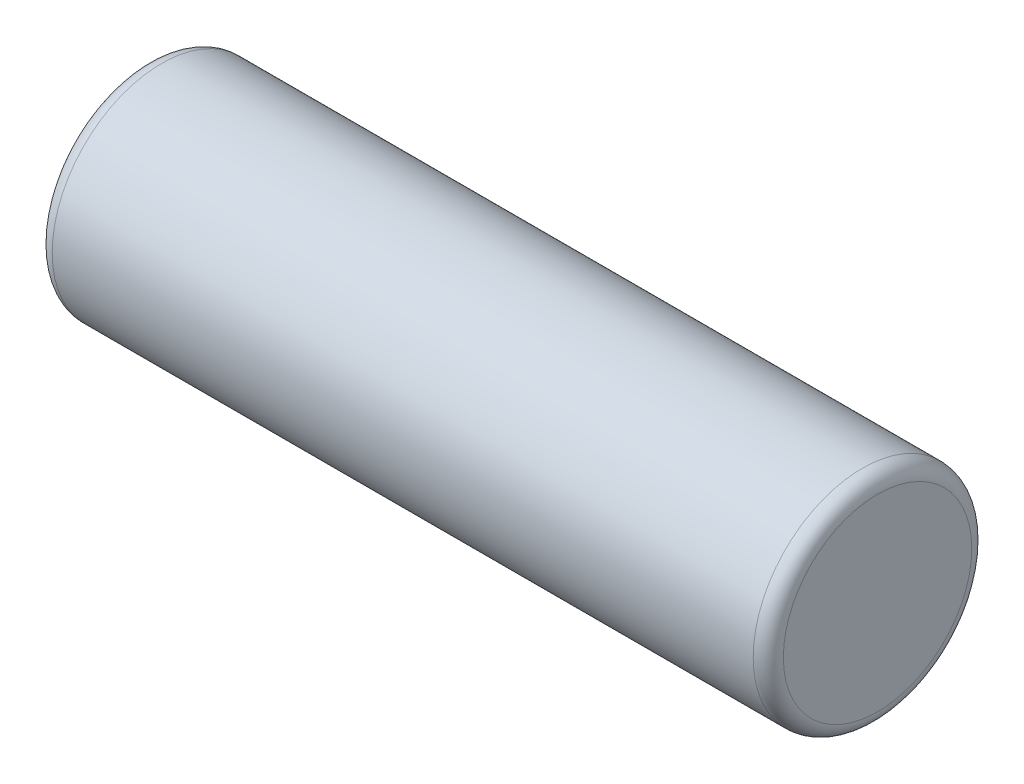
ISO-10303-21;
HEADER;
FILE_DESCRIPTION(('STEP AP214'),'2;1');
FILE_NAME('part.step','',(''),(''),'','','');
FILE_SCHEMA(('AUTOMOTIVE_DESIGN { 1 0 10303 214 1 1 1 1 }'));
ENDSEC;
DATA;
#1=APPLICATION_CONTEXT('core data for automotive mechanical design processes');
#2=APPLICATION_PROTOCOL_DEFINITION('international standard','automotive_design',2000,#1);
#3=PRODUCT_CONTEXT('',#1,'mechanical');
#4=PRODUCT('Part','Part','',(#3));
#5=PRODUCT_RELATED_PRODUCT_CATEGORY('part','',(#4));
#6=PRODUCT_DEFINITION_FORMATION('','',#4);
#7=PRODUCT_DEFINITION_CONTEXT('part definition',#1,'design');
#8=PRODUCT_DEFINITION('design','',#6,#7);
#9=PRODUCT_DEFINITION_SHAPE('','',#8);
#10=(LENGTH_UNIT() NAMED_UNIT(*) SI_UNIT(.MILLI.,.METRE.));
#11=(NAMED_UNIT(*) PLANE_ANGLE_UNIT() SI_UNIT($,.RADIAN.));
#12=(NAMED_UNIT(*) SI_UNIT($,.STERADIAN.) SOLID_ANGLE_UNIT());
#13=UNCERTAINTY_MEASURE_WITH_UNIT(LENGTH_MEASURE(1.E-05),#10,'distance_accuracy_value','');
#14=(GEOMETRIC_REPRESENTATION_CONTEXT(3) GLOBAL_UNCERTAINTY_ASSIGNED_CONTEXT((#13)) GLOBAL_UNIT_ASSIGNED_CONTEXT((#10,
#11,#12)) REPRESENTATION_CONTEXT('',''));
#15=CARTESIAN_POINT('',(0.,0.,0.));
#16=DIRECTION('',(0.,0.,1.));
#17=DIRECTION('',(1.,0.,0.));
#18=AXIS2_PLACEMENT_3D('',#15,#16,#17);
#19=CARTESIAN_POINT('',(-1.,0.,0.));
#20=DIRECTION('',(1.,0.,0.));
#21=DIRECTION('',(0.,0.,-1.));
#22=AXIS2_PLACEMENT_3D('',#19,#20,#21);
#23=PLANE('',#22);
#24=DIRECTION('',(0.,-0.0214498907795891,0.999769924625433));
#25=VECTOR('',#24,1.);
#26=CARTESIAN_POINT('',(-1.,-2.247909104811,-0.0973842647244998));
#27=LINE('',#26,#25);
#28=CARTESIAN_POINT('',(-0.999999999998785,-2.24999844077512,-9.29528188159216E-07));
#29=VERTEX_POINT('',#28);
#30=CARTESIAN_POINT('',(-0.999999999845753,-2.24790909149256,-0.0973845735524115));
#31=VERTEX_POINT('',#30);
#32=EDGE_CURVE('E84',#29,#31,#27,.F.);
#33=ORIENTED_EDGE('',*,*,#32,.F.);
#34=CARTESIAN_POINT('',(-0.999999999692457,0.,2.25001753691978));
#35=CARTESIAN_POINT('',(-0.999999999699434,-0.0368158581438385,2.25001811895792));
#36=CARTESIAN_POINT('',(-0.999999999706292,-0.0736316449703827,2.24911357081239));
#37=CARTESIAN_POINT('',(-0.999999999719771,-0.147174542179384,2.24549982211062));
#38=CARTESIAN_POINT('',(-0.999999999726392,-0.183901652585357,2.24279062203301));
#39=CARTESIAN_POINT('',(-0.999999999739396,-0.257178673049047,2.23557317837516));
#40=CARTESIAN_POINT('',(-0.999999999745779,-0.293728583153757,2.23106493527206));
#41=CARTESIAN_POINT('',(-0.999999999758308,-0.366563163265358,2.22026051344813));
#42=CARTESIAN_POINT('',(-0.999999999764454,-0.402847833342592,2.21396433520149));
#43=CARTESIAN_POINT('',(-0.999999999776508,-0.475064517351697,2.19959914612055));
#44=CARTESIAN_POINT('',(-0.999999999782417,-0.510996531377098,2.19153013575644));
#45=CARTESIAN_POINT('',(-0.999999999793996,-0.582421340968644,2.17363874000847));
#46=CARTESIAN_POINT('',(-0.999999999799667,-0.617914136651277,2.16381635508963));
#47=CARTESIAN_POINT('',(-0.999999999810772,-0.688375004304049,2.14244186941194));
#48=CARTESIAN_POINT('',(-0.999999999816206,-0.723343076413353,2.13088976911185));
#49=CARTESIAN_POINT('',(-0.999999999826836,-0.792670256111568,2.10608368487962));
#50=CARTESIAN_POINT('',(-0.999999999832032,-0.827029363861988,2.09282970139886));
#51=CARTESIAN_POINT('',(-0.999999999842187,-0.895055841048674,2.06465178137515));
#52=CARTESIAN_POINT('',(-0.999999999847146,-0.928723210668402,2.04972784527511));
#53=CARTESIAN_POINT('',(-0.999999999856826,-0.995285104322772,2.01824597405902));
#54=CARTESIAN_POINT('',(-0.999999999861547,-1.02817962856239,2.00168803937634));
#55=CARTESIAN_POINT('',(-0.999999999870753,-1.09311658607516,1.96697806135227));
#56=CARTESIAN_POINT('',(-0.999999999875237,-1.12515901957431,1.94882601843366));
#57=CARTESIAN_POINT('',(-0.999999999883968,-1.18831460302957,1.9109715546512));
#58=CARTESIAN_POINT('',(-0.999999999888214,-1.21942775323214,1.89126913419854));
#59=CARTESIAN_POINT('',(-0.99999999989647,-1.28064981628306,1.85036138102519));
#60=CARTESIAN_POINT('',(-0.999999999900479,-1.31075872939775,1.82915604870311));
#61=CARTESIAN_POINT('',(-0.99999999990826,-1.36989978379668,1.78529355809155));
#62=CARTESIAN_POINT('',(-0.999999999912032,-1.39893192536651,1.76263640018714));
#63=CARTESIAN_POINT('',(-0.999999999919338,-1.45584949627492,1.71592484225882));
#64=CARTESIAN_POINT('',(-0.999999999922872,-1.48373492591763,1.69187044260551));
#65=CARTESIAN_POINT('',(-0.999999999929704,-1.53829189513759,1.64242235107628));
#66=CARTESIAN_POINT('',(-0.999999999933001,-1.56496343503678,1.61702865955558));
#67=CARTESIAN_POINT('',(-0.999999999939357,-1.61702837133783,1.56496316062911));
#68=CARTESIAN_POINT('',(-0.999999999942417,-1.64242176807867,1.53829135356232));
#69=CARTESIAN_POINT('',(-0.999999999948298,-1.69186924382405,1.48373387894105));
#70=CARTESIAN_POINT('',(-0.999999999951121,-1.71592332318381,1.45584821170851));
#71=CARTESIAN_POINT('',(-0.999999999956527,-1.76263421649335,1.39893019641449));
#72=CARTESIAN_POINT('',(-0.999999999959112,-1.78529103081372,1.36989784865713));
#73=CARTESIAN_POINT('',(-0.999999999964044,-1.82915281253558,1.31075641439043));
#74=CARTESIAN_POINT('',(-0.999999999966391,-1.85035778032213,1.28064732816665));
#75=CARTESIAN_POINT('',(-0.999999999970849,-1.89126478512127,1.2194249529642));
#76=CARTESIAN_POINT('',(-0.999999999972959,-1.91096682253247,1.18831166425187));
#77=CARTESIAN_POINT('',(-0.999999999976941,-1.94882050344607,1.12515583924278));
#78=CARTESIAN_POINT('',(-0.999999999978813,-1.96697214735967,1.09311330319248));
#79=CARTESIAN_POINT('',(-0.999999999982321,-2.00168131319382,1.02817617727602));
#80=CARTESIAN_POINT('',(-0.999999999983956,-2.01823883553718,0.995281587635832));
#81=CARTESIAN_POINT('',(-0.999999999986989,-2.04971987057927,0.928719600940435));
#82=CARTESIAN_POINT('',(-0.999999999988387,-2.06464338371138,0.895052204090191));
#83=CARTESIAN_POINT('',(-0.999999999990945,-2.09282044905633,0.827025711088068));
#84=CARTESIAN_POINT('',(-0.999999999992105,-2.1060740017121,0.792666615119646));
#85=CARTESIAN_POINT('',(-0.999999999994188,-2.13087921836098,0.723339498336484));
#86=CARTESIAN_POINT('',(-0.999999999995111,-2.14243088280548,0.688371477683247));
#87=CARTESIAN_POINT('',(-0.999999999996719,-2.16380449369418,0.617910752815705));
#88=CARTESIAN_POINT('',(-0.999999999997404,-2.17362644059713,0.582418048740561));
#89=CARTESIAN_POINT('',(-0.999999999998538,-2.19151696012576,0.51099346257315));
#90=CARTESIAN_POINT('',(-0.999999999998986,-2.19958553321647,0.475061580597367));
#91=CARTESIAN_POINT('',(-0.999999999999645,-2.21394985047674,0.402845201044101));
#92=CARTESIAN_POINT('',(-0.999999999999855,-2.2202455951165,0.366560703560144));
#93=CARTESIAN_POINT('',(-1.00000000000004,-2.23104915537766,0.293726508951421));
#94=CARTESIAN_POINT('',(-1.00000000000001,-2.23555697147327,0.257176811896995));
#95=CARTESIAN_POINT('',(-0.999999999999721,-2.24277356969468,0.183900257613082));
#96=CARTESIAN_POINT('',(-0.999999999999457,-2.24548235229762,0.147173400430584));
#97=CARTESIAN_POINT('',(-0.999999999998691,-2.24909527753464,0.0736310493451681));
#98=CARTESIAN_POINT('',(-0.99999999999819,-2.24999942064734,0.0368155554657612));
#99=CARTESIAN_POINT('',(-0.999999999997569,-2.2499984407804,8.3986624298524E-13));
#100=B_SPLINE_CURVE_WITH_KNOTS('',3,(#34,#35,#36,#37,#38,#39,#40,#41,#42,#43,#44,#45,#46,#47,
#48,#49,#50,#51,#52,#53,#54,#55,#56,#57,#58,#59,#60,#61,#62,#63,#64,#65,#66,#67,#68,#69,#70,#71,
#72,#73,#74,#75,#76,#77,#78,#79,#80,#81,#82,#83,#84,#85,#86,#87,#88,#89,#90,#91,#92,#93,#94,#95,
#96,#97,#98,#99),.UNSPECIFIED.,.F.,.F.,(4,2,2,2,2,2,2,2,2,2,2,2,2,2,2,2,2,2,2,2,2,2,2,2,2,2,2,2,
2,2,2,2,4),(0.,0.110436374464718,0.220872719639265,0.331309035523641,0.441745322117849,
0.552181579421887,0.662617807435753,0.77305400615945,0.883490175592977,0.993926315736335,
1.10436242658952,1.21479850815254,1.32523456042539,1.43567058340806,1.54610657710057,
1.65654254150291,1.76697847661507,1.87741438243707,1.9878502589689,2.09828610621055,
2.20872192416204,2.31915771282336,2.42959347219451,2.54002920227548,2.65046490306629,
2.76090057456693,2.87133621677739,2.98177182969769,3.09220741332782,3.20264296766777,
3.31307849271756,3.42351398847718,3.53394945494662),.UNSPECIFIED.);
#101=CARTESIAN_POINT('',(-0.999999999815474,0.,2.25001753691978));
#102=VERTEX_POINT('',#101);
#103=EDGE_CURVE('E75',#102,#29,#100,.T.);
#104=ORIENTED_EDGE('',*,*,#103,.F.);
#105=CARTESIAN_POINT('',(-0.999999998696299,2.24792737261029,0.097391012971594));
#106=CARTESIAN_POINT('',(-0.999999998710268,2.24637824427443,0.133158832444067));
#107=CARTESIAN_POINT('',(-0.999999998724124,2.24397407293576,0.168889544899344));
#108=CARTESIAN_POINT('',(-0.999999998751613,2.23746417887268,0.240195626249283));
#109=CARTESIAN_POINT('',(-0.999999998765245,2.23335845658712,0.275770995184008));
#110=CARTESIAN_POINT('',(-0.999999998792284,2.22345399571948,0.346685269355345));
#111=CARTESIAN_POINT('',(-0.999999998805691,2.21765525757406,0.382024174652941));
#112=CARTESIAN_POINT('',(-0.999999998832282,2.20437819565777,0.452385034953132));
#113=CARTESIAN_POINT('',(-0.999999998845465,2.19689987232008,0.487406990037468));
#114=CARTESIAN_POINT('',(-0.999999998871607,2.18028061869255,0.557054160008376));
#115=CARTESIAN_POINT('',(-0.999999998884565,2.1711396888315,0.591679374997269));
#116=CARTESIAN_POINT('',(-0.999999998910257,2.15121606303488,0.660454185549227));
#117=CARTESIAN_POINT('',(-0.999999998922992,2.14043336752273,0.694603781234959));
#118=CARTESIAN_POINT('',(-0.999999998948235,2.11725077147075,0.762349555693808));
#119=CARTESIAN_POINT('',(-0.999999998960744,2.10485087134801,0.795945734609655));
#120=CARTESIAN_POINT('',(-0.999999998985538,2.07846211667154,0.862508139328189));
#121=CARTESIAN_POINT('',(-0.999999998997824,2.06447326252762,0.895474365293345));
#122=CARTESIAN_POINT('',(-0.999999999022169,2.03493846880607,0.960701762935567));
#123=CARTESIAN_POINT('',(-0.999999999034229,2.01939252963003,0.992962934794472));
#124=CARTESIAN_POINT('',(-0.999999999058126,1.98677898245749,1.05670672933065));
#125=CARTESIAN_POINT('',(-0.999999999069962,1.96971137485344,1.08818935220871));
#126=CARTESIAN_POINT('',(-0.999999999093409,1.93409337388104,1.15030432755689));
#127=CARTESIAN_POINT('',(-0.999999999105021,1.91554298089512,1.18093668024629));
#128=CARTESIAN_POINT('',(-0.999999999128019,1.87700167020613,1.24128133105956));
#129=CARTESIAN_POINT('',(-0.999999999139406,1.85701075287459,1.27099362942071));
#130=CARTESIAN_POINT('',(-0.999999999161955,1.81563393621945,1.32943048346203));
#131=CARTESIAN_POINT('',(-0.999999999173118,1.79424803725563,1.35815503939695));
#132=CARTESIAN_POINT('',(-0.999999999195218,1.75012997799427,1.41455097071482));
#133=CARTESIAN_POINT('',(-0.999999999206156,1.72739781804395,1.44222234636939));
#134=CARTESIAN_POINT('',(-0.999999999227807,1.68063902440483,1.49644887857485));
#135=CARTESIAN_POINT('',(-0.99999999923852,1.6566123910499,1.52300403541362));
#136=CARTESIAN_POINT('',(-0.999999999259723,1.60731938715384,1.57493763436403));
#137=CARTESIAN_POINT('',(-0.999999999270212,1.58205301693245,1.60031607677916));
#138=CARTESIAN_POINT('',(-0.999999999290965,1.53033810011385,1.64983843200292));
#139=CARTESIAN_POINT('',(-0.99999999930123,1.50388955382155,1.67398234512993));
#140=CARTESIAN_POINT('',(-0.999999999321534,1.44987053879703,1.72098063935076));
#141=CARTESIAN_POINT('',(-0.999999999331574,1.42230007035418,1.74383502077715));
#142=CARTESIAN_POINT('',(-0.999999999351429,1.36610002082214,1.78820218692404));
#143=CARTESIAN_POINT('',(-0.999999999361244,1.33747044000611,1.80971497199056));
#144=CARTESIAN_POINT('',(-0.99999999938065,1.27921738828853,1.85134993710798));
#145=CARTESIAN_POINT('',(-0.999999999390241,1.24959391764332,1.87147211751754));
#146=CARTESIAN_POINT('',(-0.999999999409198,1.1894205730085,1.91028003301949));
#147=CARTESIAN_POINT('',(-0.999999999418565,1.15887069925782,1.92896576848235));
#148=CARTESIAN_POINT('',(-0.999999999437073,1.09691414558865,1.96485822622871));
#149=CARTESIAN_POINT('',(-0.999999999446215,1.06550746589114,1.98206494889366));
#150=CARTESIAN_POINT('',(-0.999999999464274,1.0019088493872,2.01496018258549));
#151=CARTESIAN_POINT('',(-0.999999999473192,0.969716912783292,2.03064869400395));
#152=CARTESIAN_POINT('',(-0.999999999490802,0.904621120410125,2.06047176548031));
#153=CARTESIAN_POINT('',(-0.999999999499495,0.871717264824478,2.074606325939));
#154=CARTESIAN_POINT('',(-0.999999999516656,0.805272594235292,2.10128929579659));
#155=CARTESIAN_POINT('',(-0.999999999525124,0.771731779396037,2.11383770560459));
#156=CARTESIAN_POINT('',(-0.999999999541837,0.704089601105235,2.13731978832709));
#157=CARTESIAN_POINT('',(-0.99999999955008,0.669988237798264,2.14825346165806));
#158=CARTESIAN_POINT('',(-0.999999999566343,0.601302650273851,2.16848116275426));
#159=CARTESIAN_POINT('',(-0.999999999574363,0.566718426180947,2.17777519094238));
#160=CARTESIAN_POINT('',(-0.999999999590177,0.497145905024464,2.19470243379466));
#161=CARTESIAN_POINT('',(-0.999999999597972,0.462157608065104,2.20233564888716));
#162=CARTESIAN_POINT('',(-0.999999999613337,0.391856648649274,2.21592386111339));
#163=CARTESIAN_POINT('',(-0.999999999620907,0.356543986276464,2.22187885867995));
#164=CARTESIAN_POINT('',(-0.999999999635823,0.285674745987903,2.23209712942973));
#165=CARTESIAN_POINT('',(-0.999999999643169,0.250118168135062,2.23636040304927));
#166=CARTESIAN_POINT('',(-0.999999999657636,0.178842089133146,2.24318529431373));
#167=CARTESIAN_POINT('',(-0.999999999664757,0.143122588026093,2.24574691239753));
#168=CARTESIAN_POINT('',(-0.999999999678776,0.0716020756599186,2.24916347939404));
#169=CARTESIAN_POINT('',(-0.999999999685673,0.0358010644218219,2.25001842874692));
#170=CARTESIAN_POINT('',(-0.999999999692457,0.,2.25001753691978));
#171=B_SPLINE_CURVE_WITH_KNOTS('',3,(#105,#106,#107,#108,#109,#110,#111,#112,#113,#114,#115,
#116,#117,#118,#119,#120,#121,#122,#123,#124,#125,#126,#127,#128,#129,#130,#131,#132,#133,#134,
#135,#136,#137,#138,#139,#140,#141,#142,#143,#144,#145,#146,#147,#148,#149,#150,#151,#152,#153,
#154,#155,#156,#157,#158,#159,#160,#161,#162,#163,#164,#165,#166,#167,#168,#169,#170),
.UNSPECIFIED.,.F.,.F.,(4,2,2,2,2,2,2,2,2,2,2,2,2,2,2,2,2,2,2,2,2,2,2,2,2,2,2,2,2,2,2,2,4),(0.,
0.107393758306314,0.214787488914596,0.322181191824846,0.429574867037064,0.536968514551251,
0.644362134367405,0.751755726485526,0.859149290905617,0.966542827627675,1.0739363366517,
1.18132981797769,1.28872327160566,1.39611669753559,1.50351009576749,1.61090346630135,
1.71829680913718,1.82569012427499,1.93308341171476,2.0404766714565,2.1478699035002,
2.25526310784587,2.36265628449351,2.47004943344312,2.5774425546947,2.68483564824825,
2.79222871410376,2.89962175226124,3.00701476272069,3.11440774548211,3.2218007005455,
3.32919362791085,3.43658652757817),.UNSPECIFIED.);
#172=CARTESIAN_POINT('',(-0.99999999934815,2.24792737957409,0.0973908537001119));
#173=VERTEX_POINT('',#172);
#174=EDGE_CURVE('E70',#173,#102,#171,.T.);
#175=ORIENTED_EDGE('',*,*,#174,.F.);
#176=DIRECTION('',(0.,0.0212607747214506,-0.999773964183027));
#177=VECTOR('',#176,1.);
#178=CARTESIAN_POINT('',(-1.,2.24792737286006,0.0973910129823183));
#179=LINE('',#178,#177);
#180=CARTESIAN_POINT('',(-0.999999999997645,2.24999816951874,4.08922419811893E-07));
#181=VERTEX_POINT('',#180);
#182=EDGE_CURVE('E78',#181,#173,#179,.F.);
#183=ORIENTED_EDGE('',*,*,#182,.F.);
#184=CARTESIAN_POINT('',(-0.99999999999301,0.,0.));
#185=DIRECTION('',(1.,0.,0.));
#186=DIRECTION('',(0.,0.,-1.));
#187=AXIS2_PLACEMENT_3D('',#184,#185,#186);
#188=CIRCLE('',#187,2.2499973560096);
#189=CARTESIAN_POINT('',(-0.999999999996214,-7.78066132901142E-08,-2.24999757634213));
#190=VERTEX_POINT('',#189);
#191=EDGE_CURVE('E81',#190,#181,#188,.T.);
#192=ORIENTED_EDGE('',*,*,#191,.F.);
#193=CARTESIAN_POINT('',(-0.999999999691496,-2.24790910506076,-0.0973842647353221));
#194=CARTESIAN_POINT('',(-0.999999999691496,-2.24790909614023,-0.0973844706187954));
#195=CARTESIAN_POINT('',(-0.999999999691496,-2.24790908721968,-0.0973846765022673));
#196=CARTESIAN_POINT('',(-0.999999999691496,-2.24790906937851,-0.0973850882692086));
#197=CARTESIAN_POINT('',(-0.999999999691496,-2.24790906045789,-0.097385294152678));
#198=CARTESIAN_POINT('',(-0.999999999691496,-2.24635944644532,-0.13314952767727));
#199=CARTESIAN_POINT('',(-0.999999999704172,-2.24395575857995,-0.168882439789164));
#200=CARTESIAN_POINT('',(-0.999999999722392,-2.23744633942237,-0.240189714247066));
#201=CARTESIAN_POINT('',(-0.999999999727937,-2.23334060860788,-0.275764076637571));
#202=CARTESIAN_POINT('',(-0.999999999740601,-2.22343628485432,-0.34667720242224));
#203=CARTESIAN_POINT('',(-0.99999999974772,-2.21763769239038,-0.382015965882527));
#204=CARTESIAN_POINT('',(-0.999999999761198,-2.20436090259493,-0.452376317588401));
#205=CARTESIAN_POINT('',(-0.999999999767558,-2.19688270573484,-0.487397905923007));
#206=CARTESIAN_POINT('',(-0.999999999780145,-2.1802637080371,-0.557044510852981));
#207=CARTESIAN_POINT('',(-0.999999999786371,-2.17112290288193,-0.591669526418268));
#208=CARTESIAN_POINT('',(-0.999999999798522,-2.15119953125527,-0.66044392598235));
#209=CARTESIAN_POINT('',(-0.999999999804447,-2.14041696524458,-0.694593310114638));
#210=CARTESIAN_POINT('',(-0.99999999981604,-2.11723463614709,-0.762338670543325));
#211=CARTESIAN_POINT('',(-0.999999999821708,-2.10483487351421,-0.795934646995046));
#212=CARTESIAN_POINT('',(-0.999999999832777,-2.07844640073533,-0.862496650461054));
#213=CARTESIAN_POINT('',(-0.999999999838177,-2.06445769103531,-0.895462677652146));
#214=CARTESIAN_POINT('',(-0.999999999848712,-2.03492319321204,-0.960689683149954));
#215=CARTESIAN_POINT('',(-0.999999999853847,-2.01937740552581,-0.992950661654553));
#216=CARTESIAN_POINT('',(-0.999999999863851,-1.9867641681277,-1.05669407470026));
#217=CARTESIAN_POINT('',(-0.99999999986872,-1.9696967188429,-1.08817650945988));
#218=CARTESIAN_POINT('',(-0.999999999878192,-1.93407904116418,-1.15029111411312));
#219=CARTESIAN_POINT('',(-0.999999999882795,-1.91552881318644,-1.18092328424539));
#220=CARTESIAN_POINT('',(-0.999999999891735,-1.87698783900228,-1.24126757567033));
#221=CARTESIAN_POINT('',(-0.999999999896072,-1.85699709320019,-1.27097969722122));
#222=CARTESIAN_POINT('',(-0.999999999904481,-1.81562062592613,-1.32941620358603));
#223=CARTESIAN_POINT('',(-0.999999999908552,-1.79423490484571,-1.35814058867717));
#224=CARTESIAN_POINT('',(-0.999999999916429,-1.75011720749994,-1.414536184457));
#225=CARTESIAN_POINT('',(-0.999999999920234,-1.72738523161244,-1.44220739544127));
#226=CARTESIAN_POINT('',(-0.99999999992758,-1.68062681206916,-1.49643360466099));
#227=CARTESIAN_POINT('',(-0.999999999931119,-1.65660036877669,-1.52298860320972));
#228=CARTESIAN_POINT('',(-0.999999999937932,-1.60730775079112,-1.57492189213672));
#229=CARTESIAN_POINT('',(-0.999999999941206,-1.58204157644598,-1.60030018284524));
#230=CARTESIAN_POINT('',(-0.999999999947488,-1.53032705697497,-1.64982224141146));
#231=CARTESIAN_POINT('',(-0.999999999950495,-1.50387871218089,-1.67396600961564));
#232=CARTESIAN_POINT('',(-0.999999999956245,-1.44986010555132,-1.72096402094234));
#233=CARTESIAN_POINT('',(-0.999999999958987,-1.42228984403071,-1.7438182644268));
#234=CARTESIAN_POINT('',(-0.999999999964205,-1.36609021353877,-1.78818516183404));
#235=CARTESIAN_POINT('',(-0.999999999966681,-1.33746084486469,-1.80969781613337));
#236=CARTESIAN_POINT('',(-0.999999999971368,-1.27920822241738,-1.85133252704992));
#237=CARTESIAN_POINT('',(-0.999999999973578,-1.24958496892309,-1.87145458405744));
#238=CARTESIAN_POINT('',(-0.999999999977732,-1.18941206336068,-1.91026226027449));
#239=CARTESIAN_POINT('',(-0.999999999979677,-1.15886241155258,-1.92894787988718));
#240=CARTESIAN_POINT('',(-0.9999999999833,-1.09690630631663,-1.9648401136343));
#241=CARTESIAN_POINT('',(-0.999999999984978,-1.06549985312928,-1.98204672818383));
#242=CARTESIAN_POINT('',(-0.999999999988069,-1.00190169396444,-2.01494175352381));
#243=CARTESIAN_POINT('',(-0.999999999989482,-0.969709988207354,-2.03063016474038));
#244=CARTESIAN_POINT('',(-0.999999999992041,-0.904614661610393,-2.06045304386556));
#245=CARTESIAN_POINT('',(-0.999999999993188,-0.871711040970332,-2.07458751221033));
#246=CARTESIAN_POINT('',(-0.999999999995216,-0.805266844111591,-2.10127030606176));
#247=CARTESIAN_POINT('',(-0.999999999996097,-0.771726268071689,-2.11381863201361));
#248=CARTESIAN_POINT('',(-0.999999999997592,-0.70408457096841,-2.13730055540974));
#249=CARTESIAN_POINT('',(-0.999999999998207,-0.669983450062365,-2.14823415330723));
#250=CARTESIAN_POINT('',(-0.999999999999171,-0.601298350670896,-2.16846171208149));
#251=CARTESIAN_POINT('',(-0.999999999999521,-0.566714372320999,-2.17775567341847));
#252=CARTESIAN_POINT('',(-0.999999999999953,-0.49714234571657,-2.19468279126707));
#253=CARTESIAN_POINT('',(-1.00000000000004,-0.462154297575451,-2.20231594824484));
#254=CARTESIAN_POINT('',(-0.999999999999937,-0.391853838589661,-2.21590405308804));
#255=CARTESIAN_POINT('',(-0.999999999999754,-0.356541427836033,-2.22185900142448));
#256=CARTESIAN_POINT('',(-0.999999999999123,-0.285672693299534,-2.23207718270189));
#257=CARTESIAN_POINT('',(-0.999999999998675,-0.250116369585125,-2.23634041611767));
#258=CARTESIAN_POINT('',(-0.999999999997512,-0.178840801086176,-2.24316523609789));
#259=CARTESIAN_POINT('',(-0.999999999996798,-0.143121556347365,-2.24572682313993));
#260=CARTESIAN_POINT('',(-0.999999999995103,-0.0716015586496742,-2.24914333730244));
#261=CARTESIAN_POINT('',(-0.999999999994123,-0.0358008057136743,-2.24999826490192));
#262=CARTESIAN_POINT('',(-0.99999999999301,0.,-2.2499973560096));
#263=B_SPLINE_CURVE_WITH_KNOTS('',3,(#193,#194,#195,#196,#197,#198,#199,#200,#201,#202,#203,
#204,#205,#206,#207,#208,#209,#210,#211,#212,#213,#214,#215,#216,#217,#218,#219,#220,#221,#222,
#223,#224,#225,#226,#227,#228,#229,#230,#231,#232,#233,#234,#235,#236,#237,#238,#239,#240,#241,
#242,#243,#244,#245,#246,#247,#248,#249,#250,#251,#252,#253,#254,#255,#256,#257,#258,#259,#260,
#261,#262),.UNSPECIFIED.,.F.,.F.,(4,2,2,2,2,2,2,2,2,2,2,2,2,2,2,2,2,2,2,2,2,2,2,2,2,2,2,2,2,2,2,
2,2,2,4),(0.,6.18229911225991E-07,1.23645982243181E-06,0.107393985409417,0.214786704217343,
0.322179392883593,0.429572051408174,0.536964988817566,0.644357896085114,0.751750773210813,
0.859143620194671,0.966536437036682,1.07392922373685,1.18132198029517,1.28871470671164,
1.39610740298627,1.50350006911906,1.61089270511,1.71828531095909,1.82567788666634,
1.93307043223174,2.0404629476553,2.14785543293702,2.25524788807688,2.36264031307491,
2.47003270793109,2.57742507264542,2.6848174072179,2.79220971164854,2.89960198593734,
3.00699423008429,3.1143864440894,3.22177862795266,3.32917078167407,3.43656290525364),.UNSPECIFIED.);
#264=EDGE_CURVE('E99',#31,#190,#263,.T.);
#265=ORIENTED_EDGE('',*,*,#264,.F.);
#266=EDGE_LOOP('',(#33,#104,#175,#183,#192,#265));
#267=FACE_BOUND('',#266,.T.);
#268=ADVANCED_FACE('F17',(#267),#23,.F.);
#269=CARTESIAN_POINT('',(-0.5,0.,0.));
#270=DIRECTION('',(1.,0.,0.));
#271=DIRECTION('',(0.,0.,-1.));
#272=AXIS2_PLACEMENT_3D('',#269,#270,#271);
#273=TOROIDAL_SURFACE('',#272,2.25,0.5);
#274=ORIENTED_EDGE('',*,*,#174,.T.);
#275=ORIENTED_EDGE('',*,*,#103,.T.);
#276=ORIENTED_EDGE('',*,*,#32,.T.);
#277=ORIENTED_EDGE('',*,*,#264,.T.);
#278=ORIENTED_EDGE('',*,*,#191,.T.);
#279=ORIENTED_EDGE('',*,*,#182,.T.);
#280=EDGE_LOOP('',(#274,#275,#276,#277,#278,#279));
#281=FACE_BOUND('',#280,.T.);
#282=CARTESIAN_POINT('',(-0.5,0.,0.));
#283=DIRECTION('',(1.,0.,0.));
#284=DIRECTION('',(0.,0.,-1.));
#285=AXIS2_PLACEMENT_3D('',#282,#283,#284);
#286=CIRCLE('',#285,2.74999999999999);
#287=CARTESIAN_POINT('',(-0.5,0.,-2.74999999999999));
#288=VERTEX_POINT('',#287);
#289=EDGE_CURVE('E213',#288,#288,#286,.T.);
#290=ORIENTED_EDGE('',*,*,#289,.F.);
#291=EDGE_LOOP('',(#290));
#292=FACE_BOUND('',#291,.T.);
#293=ADVANCED_FACE('F72',(#281,#292),#273,.T.);
#294=CARTESIAN_POINT('',(-1.05,0.,0.));
#295=DIRECTION('',(1.,0.,0.));
#296=DIRECTION('',(0.,0.,-1.));
#297=AXIS2_PLACEMENT_3D('',#294,#295,#296);
#298=CYLINDRICAL_SURFACE('',#297,2.74999999999999);
#299=ORIENTED_EDGE('',*,*,#289,.T.);
#300=EDGE_LOOP('',(#299));
#301=FACE_BOUND('',#300,.T.);
#302=CARTESIAN_POINT('',(0.,0.,0.));
#303=DIRECTION('',(1.,0.,0.));
#304=DIRECTION('',(0.,0.,-1.));
#305=AXIS2_PLACEMENT_3D('',#302,#303,#304);
#306=CIRCLE('',#305,2.74999999999999);
#307=CARTESIAN_POINT('',(0.,0.,-2.74999999999999));
#308=VERTEX_POINT('',#307);
#309=EDGE_CURVE('E207',#308,#308,#306,.F.);
#310=ORIENTED_EDGE('',*,*,#309,.T.);
#311=EDGE_LOOP('',(#310));
#312=FACE_BOUND('',#311,.T.);
#313=ADVANCED_FACE('F127',(#301,#312),#298,.T.);
#314=CARTESIAN_POINT('',(0.,0.,0.));
#315=DIRECTION('',(1.,0.,0.));
#316=DIRECTION('',(0.,0.,-1.));
#317=AXIS2_PLACEMENT_3D('',#314,#315,#316);
#318=PLANE('',#317);
#319=ORIENTED_EDGE('',*,*,#309,.F.);
#320=EDGE_LOOP('',(#319));
#321=FACE_BOUND('',#320,.T.);
#322=CARTESIAN_POINT('',(1.93638508005911E-13,3.81639164714898E-13,-2.08999484385686E-11));
#323=DIRECTION('',(1.,0.,0.));
#324=DIRECTION('',(0.,0.,1.));
#325=AXIS2_PLACEMENT_3D('',#322,#323,#324);
#326=CIRCLE('',#325,6.24999937755244);
#327=CARTESIAN_POINT('',(2.32496313867792E-13,3.82787108692852E-13,6.249999004063));
#328=VERTEX_POINT('',#327);
#329=CARTESIAN_POINT('',(2.32496313867792E-13,3.81292220074987E-13,-6.2499990041048));
#330=VERTEX_POINT('',#329);
#331=EDGE_CURVE('E203',#328,#330,#326,.T.);
#332=ORIENTED_EDGE('',*,*,#331,.F.);
#333=CARTESIAN_POINT('',(7.74987712892639E-13,3.81639164714898E-13,-2.08999484385686E-11));
#334=DIRECTION('',(1.,0.,0.));
#335=DIRECTION('',(0.,0.,-1.));
#336=AXIS2_PLACEMENT_3D('',#333,#334,#335);
#337=CIRCLE('',#336,6.24999875510487);
#338=EDGE_CURVE('E205',#330,#328,#337,.T.);
#339=ORIENTED_EDGE('',*,*,#338,.F.);
#340=EDGE_LOOP('',(#332,#339));
#341=FACE_BOUND('',#340,.T.);
#342=ADVANCED_FACE('F185',(#321,#341),#318,.F.);
#343=CARTESIAN_POINT('',(48.5,0.,0.));
#344=DIRECTION('',(1.,0.,0.));
#345=DIRECTION('',(0.,0.,-1.));
#346=AXIS2_PLACEMENT_3D('',#343,#344,#345);
#347=PLANE('',#346);
#348=CARTESIAN_POINT('',(48.5,0.,2.63504496000877E-12));
#349=DIRECTION('',(-1.,0.,0.));
#350=DIRECTION('',(0.,0.,-1.));
#351=AXIS2_PLACEMENT_3D('',#348,#349,#350);
#352=CIRCLE('',#351,6.24999998680589);
#353=CARTESIAN_POINT('',(48.5,0.,-6.24999997097031));
#354=VERTEX_POINT('',#353);
#355=CARTESIAN_POINT('',(48.5,0.,6.24999998153087));
#356=VERTEX_POINT('',#355);
#357=EDGE_CURVE('E202',#354,#356,#352,.T.);
#358=ORIENTED_EDGE('',*,*,#357,.F.);
#359=CARTESIAN_POINT('',(48.5,0.,2.63504496000877E-12));
#360=DIRECTION('',(-1.,0.,0.));
#361=DIRECTION('',(0.,1.,-4.21557403638898E-13));
#362=AXIS2_PLACEMENT_3D('',#359,#360,#361);
#363=CIRCLE('',#362,6.24999994722353);
#364=CARTESIAN_POINT('',(48.4999999999999,6.24999977907532,0.));
#365=VERTEX_POINT('',#364);
#366=EDGE_CURVE('E37',#354,#365,#363,.F.);
#367=ORIENTED_EDGE('',*,*,#366,.T.);
#368=DIRECTION('',(0.,-0.00556758330078551,0.999984500887983));
#369=VECTOR('',#368,1.);
#370=CARTESIAN_POINT('',(48.5,6.2499999472235,0.));
#371=LINE('',#370,#369);
#372=CARTESIAN_POINT('',(48.4999999999999,6.24961332422613,0.0694727003056554));
#373=VERTEX_POINT('',#372);
#374=EDGE_CURVE('E201',#365,#373,#371,.T.);
#375=ORIENTED_EDGE('',*,*,#374,.T.);
#376=CARTESIAN_POINT('',(48.5,0.,2.63504496000877E-12));
#377=DIRECTION('',(-1.,0.,0.));
#378=DIRECTION('',(0.,0.,1.));
#379=AXIS2_PLACEMENT_3D('',#376,#377,#378);
#380=CIRCLE('',#379,6.24999998680589);
#381=EDGE_CURVE('E172',#373,#356,#380,.F.);
#382=ORIENTED_EDGE('',*,*,#381,.T.);
#383=EDGE_LOOP('',(#358,#367,#375,#382));
#384=FACE_BOUND('',#383,.T.);
#385=ADVANCED_FACE('F177',(#384),#347,.T.);
#386=CARTESIAN_POINT('',(1.,3.81639164714898E-13,-2.08999484385686E-11));
#387=DIRECTION('',(1.,0.,0.));
#388=DIRECTION('',(0.,0.,-1.));
#389=AXIS2_PLACEMENT_3D('',#386,#387,#388);
#390=TOROIDAL_SURFACE('',#389,6.25,1.);
#391=ORIENTED_EDGE('',*,*,#338,.T.);
#392=ORIENTED_EDGE('',*,*,#331,.T.);
#393=EDGE_LOOP('',(#391,#392));
#394=FACE_BOUND('',#393,.T.);
#395=CARTESIAN_POINT('',(1.,0.,0.));
#396=DIRECTION('',(1.,0.,0.));
#397=DIRECTION('',(0.,0.,-1.));
#398=AXIS2_PLACEMENT_3D('',#395,#396,#397);
#399=CIRCLE('',#398,7.24999999999999);
#400=CARTESIAN_POINT('',(1.,0.,-7.24999999999999));
#401=VERTEX_POINT('',#400);
#402=EDGE_CURVE('E28',#401,#401,#399,.T.);
#403=ORIENTED_EDGE('',*,*,#402,.F.);
#404=EDGE_LOOP('',(#403));
#405=FACE_BOUND('',#404,.T.);
#406=ADVANCED_FACE('F159',(#394,#405),#390,.T.);
#407=CARTESIAN_POINT('',(47.5,0.,2.63504496000877E-12));
#408=DIRECTION('',(1.,0.,0.));
#409=DIRECTION('',(0.,0.,-1.));
#410=AXIS2_PLACEMENT_3D('',#407,#408,#409);
#411=TOROIDAL_SURFACE('',#410,6.25000000000001,0.999999999999991);
#412=ORIENTED_EDGE('',*,*,#357,.T.);
#413=ORIENTED_EDGE('',*,*,#381,.F.);
#414=ORIENTED_EDGE('',*,*,#374,.F.);
#415=ORIENTED_EDGE('',*,*,#366,.F.);
#416=EDGE_LOOP('',(#412,#413,#414,#415));
#417=FACE_BOUND('',#416,.T.);
#418=CARTESIAN_POINT('',(47.5,0.,0.));
#419=DIRECTION('',(1.,0.,0.));
#420=DIRECTION('',(0.,0.,-1.));
#421=AXIS2_PLACEMENT_3D('',#418,#419,#420);
#422=CIRCLE('',#421,7.24999999999999);
#423=CARTESIAN_POINT('',(47.5,0.,-7.24999999999999));
#424=VERTEX_POINT('',#423);
#425=EDGE_CURVE('E10',#424,#424,#422,.F.);
#426=ORIENTED_EDGE('',*,*,#425,.F.);
#427=EDGE_LOOP('',(#426));
#428=FACE_BOUND('',#427,.T.);
#429=ADVANCED_FACE('F147',(#417,#428),#411,.T.);
#430=CARTESIAN_POINT('',(-2.425,0.,0.));
#431=DIRECTION('',(1.,0.,0.));
#432=DIRECTION('',(0.,0.,-1.));
#433=AXIS2_PLACEMENT_3D('',#430,#431,#432);
#434=CYLINDRICAL_SURFACE('',#433,7.24999999999999);
#435=ORIENTED_EDGE('',*,*,#402,.T.);
#436=EDGE_LOOP('',(#435));
#437=FACE_BOUND('',#436,.T.);
#438=ORIENTED_EDGE('',*,*,#425,.T.);
#439=EDGE_LOOP('',(#438));
#440=FACE_BOUND('',#439,.T.);
#441=ADVANCED_FACE('F158',(#437,#440),#434,.T.);
#442=CLOSED_SHELL('',(#268,#293,#313,#342,#385,#406,#429,#441));
#443=MANIFOLD_SOLID_BREP('B1',#442);
#444=ADVANCED_BREP_SHAPE_REPRESENTATION('',(#18,#443),#14);
#445=SHAPE_DEFINITION_REPRESENTATION(#9,#444);
ENDSEC;
END-ISO-10303-21;
